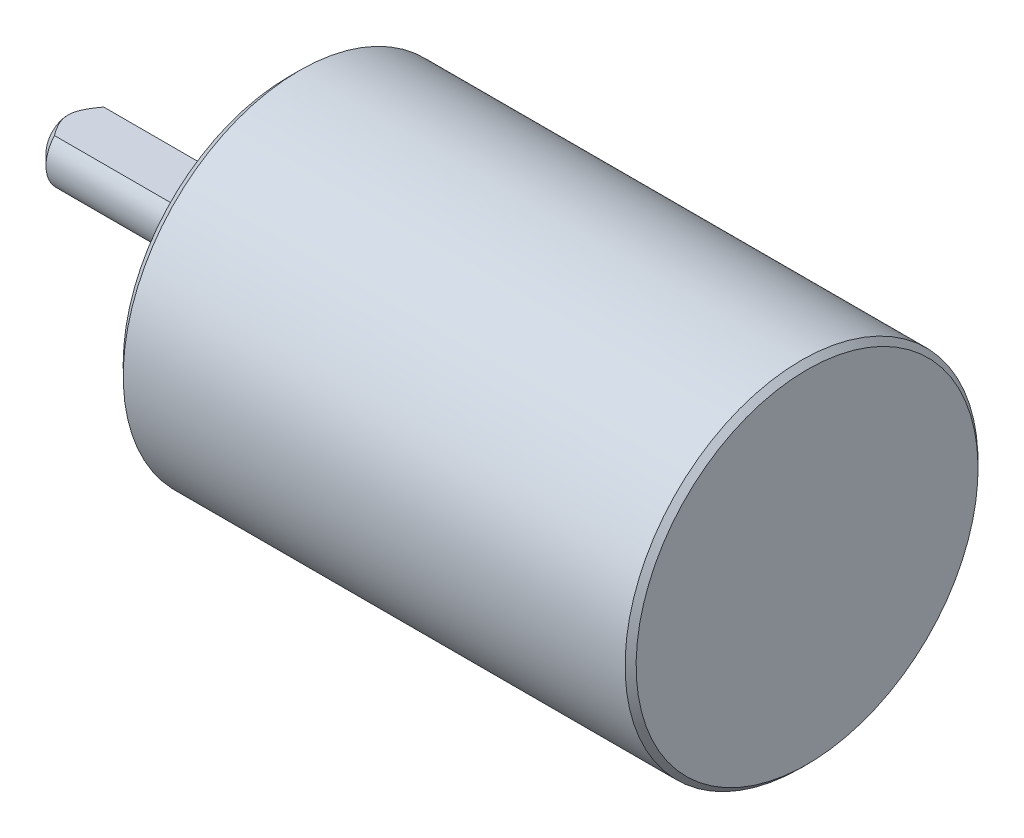
ISO-10303-21;
HEADER;
FILE_DESCRIPTION(('STEP AP214'),'2;1');
FILE_NAME('part.step','',(''),(''),'','','');
FILE_SCHEMA(('AUTOMOTIVE_DESIGN { 1 0 10303 214 1 1 1 1 }'));
ENDSEC;
DATA;
#1=APPLICATION_CONTEXT('core data for automotive mechanical design processes');
#2=APPLICATION_PROTOCOL_DEFINITION('international standard','automotive_design',2000,#1);
#3=PRODUCT_CONTEXT('',#1,'mechanical');
#4=PRODUCT('Part','Part','',(#3));
#5=PRODUCT_RELATED_PRODUCT_CATEGORY('part','',(#4));
#6=PRODUCT_DEFINITION_FORMATION('','',#4);
#7=PRODUCT_DEFINITION_CONTEXT('part definition',#1,'design');
#8=PRODUCT_DEFINITION('design','',#6,#7);
#9=PRODUCT_DEFINITION_SHAPE('','',#8);
#10=(LENGTH_UNIT() NAMED_UNIT(*) SI_UNIT(.MILLI.,.METRE.));
#11=(NAMED_UNIT(*) PLANE_ANGLE_UNIT() SI_UNIT($,.RADIAN.));
#12=(NAMED_UNIT(*) SI_UNIT($,.STERADIAN.) SOLID_ANGLE_UNIT());
#13=UNCERTAINTY_MEASURE_WITH_UNIT(LENGTH_MEASURE(1.E-05),#10,'distance_accuracy_value','');
#14=(GEOMETRIC_REPRESENTATION_CONTEXT(3) GLOBAL_UNCERTAINTY_ASSIGNED_CONTEXT((#13)) GLOBAL_UNIT_ASSIGNED_CONTEXT((#10,
#11,#12)) REPRESENTATION_CONTEXT('',''));
#15=CARTESIAN_POINT('',(0.,0.,0.));
#16=DIRECTION('',(0.,0.,1.));
#17=DIRECTION('',(1.,0.,0.));
#18=AXIS2_PLACEMENT_3D('',#15,#16,#17);
#19=CARTESIAN_POINT('',(0.,0.,0.));
#20=DIRECTION('',(-1.,0.,0.));
#21=DIRECTION('',(0.,-1.,0.));
#22=AXIS2_PLACEMENT_3D('',#19,#20,#21);
#23=PLANE('',#22);
#24=CARTESIAN_POINT('',(0.,0.,0.));
#25=DIRECTION('',(-1.,0.,0.));
#26=DIRECTION('',(0.,-1.,0.));
#27=AXIS2_PLACEMENT_3D('',#24,#25,#26);
#28=CIRCLE('',#27,2.00000000000004);
#29=CARTESIAN_POINT('',(0.,2.,0.));
#30=VERTEX_POINT('',#29);
#31=EDGE_CURVE('E142',#30,#30,#28,.T.);
#32=ORIENTED_EDGE('',*,*,#31,.T.);
#33=EDGE_LOOP('',(#32));
#34=FACE_BOUND('',#33,.T.);
#35=ADVANCED_FACE('F34',(#34),#23,.T.);
#36=CARTESIAN_POINT('',(67.,0.,0.));
#37=DIRECTION('',(1.,0.,0.));
#38=DIRECTION('',(0.,1.,0.));
#39=AXIS2_PLACEMENT_3D('',#36,#37,#38);
#40=CYLINDRICAL_SURFACE('',#39,3.);
#41=DIRECTION('',(1.,0.,0.));
#42=VECTOR('',#41,1.);
#43=CARTESIAN_POINT('',(67.,2.00000000000002,-2.23606797749979));
#44=LINE('',#43,#42);
#45=CARTESIAN_POINT('',(15.,2.,-2.23606797749979));
#46=VERTEX_POINT('',#45);
#47=CARTESIAN_POINT('',(0.999999999999959,2.,-2.23606797749979));
#48=VERTEX_POINT('',#47);
#49=EDGE_CURVE('E83',#46,#48,#44,.F.);
#50=ORIENTED_EDGE('',*,*,#49,.F.);
#51=CARTESIAN_POINT('',(15.,0.,0.));
#52=DIRECTION('',(1.,0.,0.));
#53=DIRECTION('',(0.,1.,0.));
#54=AXIS2_PLACEMENT_3D('',#51,#52,#53);
#55=CIRCLE('',#54,3.);
#56=CARTESIAN_POINT('',(15.,2.,2.23606797749979));
#57=VERTEX_POINT('',#56);
#58=EDGE_CURVE('E11',#57,#46,#55,.F.);
#59=ORIENTED_EDGE('',*,*,#58,.F.);
#60=DIRECTION('',(1.,0.,0.));
#61=VECTOR('',#60,1.);
#62=CARTESIAN_POINT('',(67.,2.00000000000002,2.23606797749979));
#63=LINE('',#62,#61);
#64=CARTESIAN_POINT('',(0.999999999999959,2.,2.23606797749979));
#65=VERTEX_POINT('',#64);
#66=EDGE_CURVE('E73',#65,#57,#63,.T.);
#67=ORIENTED_EDGE('',*,*,#66,.F.);
#68=CARTESIAN_POINT('',(0.999999999999959,0.,0.));
#69=DIRECTION('',(-1.,0.,0.));
#70=DIRECTION('',(0.,-1.,0.));
#71=AXIS2_PLACEMENT_3D('',#68,#69,#70);
#72=CIRCLE('',#71,3.);
#73=EDGE_CURVE('E90',#65,#48,#72,.F.);
#74=ORIENTED_EDGE('',*,*,#73,.T.);
#75=EDGE_LOOP('',(#50,#59,#67,#74));
#76=FACE_BOUND('',#75,.T.);
#77=CARTESIAN_POINT('',(17.,0.,0.));
#78=DIRECTION('',(1.,0.,0.));
#79=DIRECTION('',(0.,1.,0.));
#80=AXIS2_PLACEMENT_3D('',#77,#78,#79);
#81=CIRCLE('',#80,2.99999999999999);
#82=CARTESIAN_POINT('',(17.,3.,0.));
#83=VERTEX_POINT('',#82);
#84=EDGE_CURVE('E120',#83,#83,#81,.T.);
#85=ORIENTED_EDGE('',*,*,#84,.F.);
#86=EDGE_LOOP('',(#85));
#87=FACE_BOUND('',#86,.T.);
#88=ADVANCED_FACE('F88',(#76,#87),#40,.T.);
#89=CARTESIAN_POINT('',(17.,3.,0.));
#90=DIRECTION('',(-1.,0.,0.));
#91=DIRECTION('',(0.,-1.,0.));
#92=AXIS2_PLACEMENT_3D('',#89,#90,#91);
#93=PLANE('',#92);
#94=CARTESIAN_POINT('',(17.,0.,0.));
#95=DIRECTION('',(-1.,0.,0.));
#96=DIRECTION('',(0.,-1.,0.));
#97=AXIS2_PLACEMENT_3D('',#94,#95,#96);
#98=CIRCLE('',#97,8.99999999999999);
#99=CARTESIAN_POINT('',(17.,-8.99999999999998,0.));
#100=VERTEX_POINT('',#99);
#101=EDGE_CURVE('E138',#100,#100,#98,.T.);
#102=ORIENTED_EDGE('',*,*,#101,.T.);
#103=EDGE_LOOP('',(#102));
#104=FACE_BOUND('',#103,.T.);
#105=ORIENTED_EDGE('',*,*,#84,.T.);
#106=EDGE_LOOP('',(#105));
#107=FACE_BOUND('',#106,.T.);
#108=ADVANCED_FACE('F201',(#104,#107),#93,.T.);
#109=CARTESIAN_POINT('',(67.,0.,0.));
#110=DIRECTION('',(1.,0.,0.));
#111=DIRECTION('',(0.,1.,0.));
#112=AXIS2_PLACEMENT_3D('',#109,#110,#111);
#113=CYLINDRICAL_SURFACE('',#112,9.99999999999999);
#114=CARTESIAN_POINT('',(18.,0.,0.));
#115=DIRECTION('',(-1.,0.,0.));
#116=DIRECTION('',(0.,-1.,0.));
#117=AXIS2_PLACEMENT_3D('',#114,#115,#116);
#118=CIRCLE('',#117,9.99999999999999);
#119=CARTESIAN_POINT('',(18.,-9.99999999999998,0.));
#120=VERTEX_POINT('',#119);
#121=EDGE_CURVE('E135',#120,#120,#118,.F.);
#122=ORIENTED_EDGE('',*,*,#121,.T.);
#123=EDGE_LOOP('',(#122));
#124=FACE_BOUND('',#123,.T.);
#125=CARTESIAN_POINT('',(20.,0.,0.));
#126=DIRECTION('',(1.,0.,0.));
#127=DIRECTION('',(0.,1.,0.));
#128=AXIS2_PLACEMENT_3D('',#125,#126,#127);
#129=CIRCLE('',#128,9.99999999999999);
#130=CARTESIAN_POINT('',(20.,9.99999999999999,0.));
#131=VERTEX_POINT('',#130);
#132=EDGE_CURVE('E117',#131,#131,#129,.T.);
#133=ORIENTED_EDGE('',*,*,#132,.F.);
#134=EDGE_LOOP('',(#133));
#135=FACE_BOUND('',#134,.T.);
#136=ADVANCED_FACE('F197',(#124,#135),#113,.T.);
#137=CARTESIAN_POINT('',(20.,9.99999999999999,0.));
#138=DIRECTION('',(-1.,0.,0.));
#139=DIRECTION('',(0.,-1.,0.));
#140=AXIS2_PLACEMENT_3D('',#137,#138,#139);
#141=PLANE('',#140);
#142=CARTESIAN_POINT('',(20.,0.,0.));
#143=DIRECTION('',(-1.,0.,0.));
#144=DIRECTION('',(0.,-1.,0.));
#145=AXIS2_PLACEMENT_3D('',#142,#143,#144);
#146=CIRCLE('',#145,15.);
#147=CARTESIAN_POINT('',(20.,-15.,0.));
#148=VERTEX_POINT('',#147);
#149=EDGE_CURVE('E132',#148,#148,#146,.T.);
#150=ORIENTED_EDGE('',*,*,#149,.T.);
#151=EDGE_LOOP('',(#150));
#152=FACE_BOUND('',#151,.T.);
#153=CARTESIAN_POINT('',(20.,0.,-13.));
#154=DIRECTION('',(-1.,0.,0.));
#155=DIRECTION('',(0.,0.,1.));
#156=AXIS2_PLACEMENT_3D('',#153,#154,#155);
#157=CIRCLE('',#156,1.25);
#158=CARTESIAN_POINT('',(20.,0.,-11.75));
#159=VERTEX_POINT('',#158);
#160=EDGE_CURVE('E91',#159,#159,#157,.T.);
#161=ORIENTED_EDGE('',*,*,#160,.F.);
#162=EDGE_LOOP('',(#161));
#163=FACE_BOUND('',#162,.T.);
#164=CARTESIAN_POINT('',(20.,13.,0.));
#165=DIRECTION('',(-1.,0.,0.));
#166=DIRECTION('',(0.,0.,1.));
#167=AXIS2_PLACEMENT_3D('',#164,#165,#166);
#168=CIRCLE('',#167,1.25);
#169=CARTESIAN_POINT('',(20.,13.,1.25));
#170=VERTEX_POINT('',#169);
#171=EDGE_CURVE('E99',#170,#170,#168,.T.);
#172=ORIENTED_EDGE('',*,*,#171,.F.);
#173=EDGE_LOOP('',(#172));
#174=FACE_BOUND('',#173,.T.);
#175=CARTESIAN_POINT('',(20.,0.,13.));
#176=DIRECTION('',(-1.,0.,0.));
#177=DIRECTION('',(0.,0.,1.));
#178=AXIS2_PLACEMENT_3D('',#175,#176,#177);
#179=CIRCLE('',#178,1.25);
#180=CARTESIAN_POINT('',(20.,0.,14.25));
#181=VERTEX_POINT('',#180);
#182=EDGE_CURVE('E105',#181,#181,#179,.T.);
#183=ORIENTED_EDGE('',*,*,#182,.F.);
#184=EDGE_LOOP('',(#183));
#185=FACE_BOUND('',#184,.T.);
#186=CARTESIAN_POINT('',(20.,-13.,0.));
#187=DIRECTION('',(-1.,0.,0.));
#188=DIRECTION('',(0.,0.,1.));
#189=AXIS2_PLACEMENT_3D('',#186,#187,#188);
#190=CIRCLE('',#189,1.25);
#191=CARTESIAN_POINT('',(20.,-13.,1.25));
#192=VERTEX_POINT('',#191);
#193=EDGE_CURVE('E111',#192,#192,#190,.T.);
#194=ORIENTED_EDGE('',*,*,#193,.F.);
#195=EDGE_LOOP('',(#194));
#196=FACE_BOUND('',#195,.T.);
#197=ORIENTED_EDGE('',*,*,#132,.T.);
#198=EDGE_LOOP('',(#197));
#199=FACE_BOUND('',#198,.T.);
#200=ADVANCED_FACE('F193',(#152,#163,#174,#185,#196,#199),#141,.T.);
#201=CARTESIAN_POINT('',(67.,0.,0.));
#202=DIRECTION('',(1.,0.,0.));
#203=DIRECTION('',(0.,1.,0.));
#204=AXIS2_PLACEMENT_3D('',#201,#202,#203);
#205=CYLINDRICAL_SURFACE('',#204,16.);
#206=CARTESIAN_POINT('',(21.,0.,0.));
#207=DIRECTION('',(-1.,0.,0.));
#208=DIRECTION('',(0.,-1.,0.));
#209=AXIS2_PLACEMENT_3D('',#206,#207,#208);
#210=CIRCLE('',#209,16.);
#211=CARTESIAN_POINT('',(21.,-16.,0.));
#212=VERTEX_POINT('',#211);
#213=EDGE_CURVE('E129',#212,#212,#210,.F.);
#214=ORIENTED_EDGE('',*,*,#213,.T.);
#215=EDGE_LOOP('',(#214));
#216=FACE_BOUND('',#215,.T.);
#217=CARTESIAN_POINT('',(66.5,0.,0.));
#218=DIRECTION('',(1.,0.,0.));
#219=DIRECTION('',(0.,1.,0.));
#220=AXIS2_PLACEMENT_3D('',#217,#218,#219);
#221=CIRCLE('',#220,16.);
#222=CARTESIAN_POINT('',(66.5,16.,0.));
#223=VERTEX_POINT('',#222);
#224=EDGE_CURVE('E126',#223,#223,#221,.F.);
#225=ORIENTED_EDGE('',*,*,#224,.T.);
#226=EDGE_LOOP('',(#225));
#227=FACE_BOUND('',#226,.T.);
#228=ADVANCED_FACE('F189',(#216,#227),#205,.T.);
#229=CARTESIAN_POINT('',(67.,16.,0.));
#230=DIRECTION('',(1.,0.,0.));
#231=DIRECTION('',(0.,1.,0.));
#232=AXIS2_PLACEMENT_3D('',#229,#230,#231);
#233=PLANE('',#232);
#234=CARTESIAN_POINT('',(67.,0.,0.));
#235=DIRECTION('',(1.,0.,0.));
#236=DIRECTION('',(0.,1.,0.));
#237=AXIS2_PLACEMENT_3D('',#234,#235,#236);
#238=CIRCLE('',#237,15.5);
#239=CARTESIAN_POINT('',(67.,15.5,0.));
#240=VERTEX_POINT('',#239);
#241=EDGE_CURVE('E123',#240,#240,#238,.T.);
#242=ORIENTED_EDGE('',*,*,#241,.T.);
#243=EDGE_LOOP('',(#242));
#244=FACE_BOUND('',#243,.T.);
#245=ADVANCED_FACE('F186',(#244),#233,.T.);
#246=CARTESIAN_POINT('',(24.,-13.,0.));
#247=DIRECTION('',(-1.,0.,0.));
#248=DIRECTION('',(0.,0.,1.));
#249=AXIS2_PLACEMENT_3D('',#246,#247,#248);
#250=CONICAL_SURFACE('',#249,1.25,1.02974425867665);
#251=CARTESIAN_POINT('',(24.7510757737845,-13.,0.));
#252=VERTEX_POINT('',#251);
#253=VERTEX_LOOP('',#252);
#254=FACE_BOUND('',#253,.T.);
#255=CARTESIAN_POINT('',(24.,-13.,0.));
#256=DIRECTION('',(-1.,0.,0.));
#257=DIRECTION('',(0.,0.,1.));
#258=AXIS2_PLACEMENT_3D('',#255,#256,#257);
#259=CIRCLE('',#258,1.25);
#260=CARTESIAN_POINT('',(24.,-13.,1.25));
#261=VERTEX_POINT('',#260);
#262=EDGE_CURVE('E114',#261,#261,#259,.T.);
#263=ORIENTED_EDGE('',*,*,#262,.T.);
#264=EDGE_LOOP('',(#263));
#265=FACE_BOUND('',#264,.T.);
#266=ADVANCED_FACE('F182',(#254,#265),#250,.F.);
#267=CARTESIAN_POINT('',(20.,-13.,0.));
#268=DIRECTION('',(-1.,0.,0.));
#269=DIRECTION('',(0.,0.,1.));
#270=AXIS2_PLACEMENT_3D('',#267,#268,#269);
#271=CYLINDRICAL_SURFACE('',#270,1.25);
#272=ORIENTED_EDGE('',*,*,#262,.F.);
#273=EDGE_LOOP('',(#272));
#274=FACE_BOUND('',#273,.T.);
#275=ORIENTED_EDGE('',*,*,#193,.T.);
#276=EDGE_LOOP('',(#275));
#277=FACE_BOUND('',#276,.T.);
#278=ADVANCED_FACE('F178',(#274,#277),#271,.F.);
#279=CARTESIAN_POINT('',(24.,0.,13.));
#280=DIRECTION('',(-1.,0.,0.));
#281=DIRECTION('',(0.,0.,1.));
#282=AXIS2_PLACEMENT_3D('',#279,#280,#281);
#283=CONICAL_SURFACE('',#282,1.25,1.02974425867665);
#284=CARTESIAN_POINT('',(24.7510757737845,0.,13.));
#285=VERTEX_POINT('',#284);
#286=VERTEX_LOOP('',#285);
#287=FACE_BOUND('',#286,.T.);
#288=CARTESIAN_POINT('',(24.,0.,13.));
#289=DIRECTION('',(-1.,0.,0.));
#290=DIRECTION('',(0.,0.,1.));
#291=AXIS2_PLACEMENT_3D('',#288,#289,#290);
#292=CIRCLE('',#291,1.25);
#293=CARTESIAN_POINT('',(24.,0.,14.25));
#294=VERTEX_POINT('',#293);
#295=EDGE_CURVE('E108',#294,#294,#292,.T.);
#296=ORIENTED_EDGE('',*,*,#295,.T.);
#297=EDGE_LOOP('',(#296));
#298=FACE_BOUND('',#297,.T.);
#299=ADVANCED_FACE('F174',(#287,#298),#283,.F.);
#300=CARTESIAN_POINT('',(20.,0.,13.));
#301=DIRECTION('',(-1.,0.,0.));
#302=DIRECTION('',(0.,0.,1.));
#303=AXIS2_PLACEMENT_3D('',#300,#301,#302);
#304=CYLINDRICAL_SURFACE('',#303,1.25);
#305=ORIENTED_EDGE('',*,*,#295,.F.);
#306=EDGE_LOOP('',(#305));
#307=FACE_BOUND('',#306,.T.);
#308=ORIENTED_EDGE('',*,*,#182,.T.);
#309=EDGE_LOOP('',(#308));
#310=FACE_BOUND('',#309,.T.);
#311=ADVANCED_FACE('F170',(#307,#310),#304,.F.);
#312=CARTESIAN_POINT('',(24.,13.,0.));
#313=DIRECTION('',(-1.,0.,0.));
#314=DIRECTION('',(0.,0.,1.));
#315=AXIS2_PLACEMENT_3D('',#312,#313,#314);
#316=CONICAL_SURFACE('',#315,1.25,1.02974425867665);
#317=CARTESIAN_POINT('',(24.7510757737845,13.,0.));
#318=VERTEX_POINT('',#317);
#319=VERTEX_LOOP('',#318);
#320=FACE_BOUND('',#319,.T.);
#321=CARTESIAN_POINT('',(24.,13.,0.));
#322=DIRECTION('',(-1.,0.,0.));
#323=DIRECTION('',(0.,0.,1.));
#324=AXIS2_PLACEMENT_3D('',#321,#322,#323);
#325=CIRCLE('',#324,1.25);
#326=CARTESIAN_POINT('',(24.,13.,1.25));
#327=VERTEX_POINT('',#326);
#328=EDGE_CURVE('E102',#327,#327,#325,.T.);
#329=ORIENTED_EDGE('',*,*,#328,.T.);
#330=EDGE_LOOP('',(#329));
#331=FACE_BOUND('',#330,.T.);
#332=ADVANCED_FACE('F166',(#320,#331),#316,.F.);
#333=CARTESIAN_POINT('',(20.,13.,0.));
#334=DIRECTION('',(-1.,0.,0.));
#335=DIRECTION('',(0.,0.,1.));
#336=AXIS2_PLACEMENT_3D('',#333,#334,#335);
#337=CYLINDRICAL_SURFACE('',#336,1.25);
#338=ORIENTED_EDGE('',*,*,#328,.F.);
#339=EDGE_LOOP('',(#338));
#340=FACE_BOUND('',#339,.T.);
#341=ORIENTED_EDGE('',*,*,#171,.T.);
#342=EDGE_LOOP('',(#341));
#343=FACE_BOUND('',#342,.T.);
#344=ADVANCED_FACE('F162',(#340,#343),#337,.F.);
#345=CARTESIAN_POINT('',(24.,0.,-13.));
#346=DIRECTION('',(-1.,0.,0.));
#347=DIRECTION('',(0.,0.,1.));
#348=AXIS2_PLACEMENT_3D('',#345,#346,#347);
#349=CONICAL_SURFACE('',#348,1.25,1.02974425867665);
#350=CARTESIAN_POINT('',(24.7510757737845,0.,-13.));
#351=VERTEX_POINT('',#350);
#352=VERTEX_LOOP('',#351);
#353=FACE_BOUND('',#352,.T.);
#354=CARTESIAN_POINT('',(24.,0.,-13.));
#355=DIRECTION('',(-1.,0.,0.));
#356=DIRECTION('',(0.,0.,1.));
#357=AXIS2_PLACEMENT_3D('',#354,#355,#356);
#358=CIRCLE('',#357,1.25);
#359=CARTESIAN_POINT('',(24.,0.,-11.75));
#360=VERTEX_POINT('',#359);
#361=EDGE_CURVE('E94',#360,#360,#358,.T.);
#362=ORIENTED_EDGE('',*,*,#361,.T.);
#363=EDGE_LOOP('',(#362));
#364=FACE_BOUND('',#363,.T.);
#365=ADVANCED_FACE('F158',(#353,#364),#349,.F.);
#366=CARTESIAN_POINT('',(20.,0.,-13.));
#367=DIRECTION('',(-1.,0.,0.));
#368=DIRECTION('',(0.,0.,1.));
#369=AXIS2_PLACEMENT_3D('',#366,#367,#368);
#370=CYLINDRICAL_SURFACE('',#369,1.25);
#371=ORIENTED_EDGE('',*,*,#361,.F.);
#372=EDGE_LOOP('',(#371));
#373=FACE_BOUND('',#372,.T.);
#374=ORIENTED_EDGE('',*,*,#160,.T.);
#375=EDGE_LOOP('',(#374));
#376=FACE_BOUND('',#375,.T.);
#377=ADVANCED_FACE('F154',(#373,#376),#370,.F.);
#378=CARTESIAN_POINT('',(67.,0.,0.));
#379=DIRECTION('',(-1.,0.,0.));
#380=DIRECTION('',(0.,-1.,0.));
#381=AXIS2_PLACEMENT_3D('',#378,#379,#380);
#382=CONICAL_SURFACE('',#381,15.5,0.785398163397452);
#383=ORIENTED_EDGE('',*,*,#224,.F.);
#384=EDGE_LOOP('',(#383));
#385=FACE_BOUND('',#384,.T.);
#386=ORIENTED_EDGE('',*,*,#241,.F.);
#387=EDGE_LOOP('',(#386));
#388=FACE_BOUND('',#387,.T.);
#389=ADVANCED_FACE('F157',(#385,#388),#382,.T.);
#390=CARTESIAN_POINT('',(21.,0.,0.));
#391=DIRECTION('',(1.,0.,0.));
#392=DIRECTION('',(0.,1.,0.));
#393=AXIS2_PLACEMENT_3D('',#390,#391,#392);
#394=CONICAL_SURFACE('',#393,16.,0.785398163397453);
#395=ORIENTED_EDGE('',*,*,#149,.F.);
#396=EDGE_LOOP('',(#395));
#397=FACE_BOUND('',#396,.T.);
#398=ORIENTED_EDGE('',*,*,#213,.F.);
#399=EDGE_LOOP('',(#398));
#400=FACE_BOUND('',#399,.T.);
#401=ADVANCED_FACE('F213',(#397,#400),#394,.T.);
#402=CARTESIAN_POINT('',(18.,0.,0.));
#403=DIRECTION('',(-1.,0.,0.));
#404=DIRECTION('',(0.,-1.,0.));
#405=AXIS2_PLACEMENT_3D('',#402,#403,#404);
#406=TOROIDAL_SURFACE('',#405,8.99999999999999,1.);
#407=ORIENTED_EDGE('',*,*,#101,.F.);
#408=EDGE_LOOP('',(#407));
#409=FACE_BOUND('',#408,.T.);
#410=ORIENTED_EDGE('',*,*,#121,.F.);
#411=EDGE_LOOP('',(#410));
#412=FACE_BOUND('',#411,.T.);
#413=ADVANCED_FACE('F216',(#409,#412),#406,.T.);
#414=CARTESIAN_POINT('',(0.999999999999959,0.,0.));
#415=DIRECTION('',(1.,0.,0.));
#416=DIRECTION('',(0.,1.,0.));
#417=AXIS2_PLACEMENT_3D('',#414,#415,#416);
#418=CONICAL_SURFACE('',#417,3.,0.785398163397449);
#419=CARTESIAN_POINT('',(2.64735037147121,2.,-4.19498098627562));
#420=CARTESIAN_POINT('',(2.56227376036563,2.,-4.1007176336002));
#421=CARTESIAN_POINT('',(2.4774769407958,2.,-4.00619969417623));
#422=CARTESIAN_POINT('',(2.30859005453811,2.,-3.81652190724905));
#423=CARTESIAN_POINT('',(2.22450004219928,2.,-3.72136201137943));
#424=CARTESIAN_POINT('',(2.05692715537562,2.,-3.52998520258133));
#425=CARTESIAN_POINT('',(1.97344697736533,2.,-3.43376592480723));
#426=CARTESIAN_POINT('',(1.80758102210381,2.,-3.24039295320355));
#427=CARTESIAN_POINT('',(1.72519520762171,2.,-3.1432392913571));
#428=CARTESIAN_POINT('',(1.55714691513772,2.,-2.94219550302539));
#429=CARTESIAN_POINT('',(1.47156568082886,2.,-2.8382372930877));
#430=CARTESIAN_POINT('',(1.30244067009423,2.,-2.62867792880836));
#431=CARTESIAN_POINT('',(1.21889680306694,2.,-2.52307684786834));
#432=CARTESIAN_POINT('',(1.05465967269191,2.,-2.30988403023064));
#433=CARTESIAN_POINT('',(0.973962945183142,2.,-2.20229497371581));
#434=CARTESIAN_POINT('',(0.816387362030972,2.,-1.98436917349164));
#435=CARTESIAN_POINT('',(0.739507571087058,2.,-1.87403311295621));
#436=CARTESIAN_POINT('',(0.607609294843402,2.,-1.67448925723662));
#437=CARTESIAN_POINT('',(0.551513028604606,2.,-1.58599803170236));
#438=CARTESIAN_POINT('',(0.443826291375629,2.,-1.40622771824962));
#439=CARTESIAN_POINT('',(0.392237885358382,2.,-1.31494737825899));
#440=CARTESIAN_POINT('',(0.295768448993919,2.,-1.12992559059664));
#441=CARTESIAN_POINT('',(0.250830526597938,2.,-1.03621418872764));
#442=CARTESIAN_POINT('',(0.169520725091139,2.,-0.845143098913066));
#443=CARTESIAN_POINT('',(0.133140141268117,2.,-0.74778723610586));
#444=CARTESIAN_POINT('',(0.0843022244844682,2.,-0.589474873118612));
#445=CARTESIAN_POINT('',(0.0681135468340602,2.,-0.529670169927612));
#446=CARTESIAN_POINT('',(0.0405378123602302,2.,-0.408954351751457));
#447=CARTESIAN_POINT('',(0.0291500046307554,2.,-0.348043411349052));
#448=CARTESIAN_POINT('',(0.0117844482097207,2.,-0.225673698629841));
#449=CARTESIAN_POINT('',(0.00578686238295228,2.,-0.164217782628723));
#450=CARTESIAN_POINT('',(-0.000525477724369348,2.,-0.0410107717533667));
#451=CARTESIAN_POINT('',(-0.000840353160307369,2.,0.0207403167997155));
#452=CARTESIAN_POINT('',(0.00423166998278092,2.,0.144008084680025));
#453=CARTESIAN_POINT('',(0.0096189610927208,2.,0.205524747577065));
#454=CARTESIAN_POINT('',(0.025785185187563,2.,0.327848129004505));
#455=CARTESIAN_POINT('',(0.0365653926983147,2.,0.388654676232908));
#456=CARTESIAN_POINT('',(0.063020229064213,2.,0.509455769763526));
#457=CARTESIAN_POINT('',(0.0787158463552608,2.,0.569445660684733));
#458=CARTESIAN_POINT('',(0.114317717751172,2.,0.688143489456393));
#459=CARTESIAN_POINT('',(0.134224092900815,2.,0.746851390400516));
#460=CARTESIAN_POINT('',(0.208649790857987,2.,0.946252272751983));
#461=CARTESIAN_POINT('',(0.271851902613598,2.,1.08371994743288));
#462=CARTESIAN_POINT('',(0.376390299297901,2.,1.28471204665488));
#463=CARTESIAN_POINT('',(0.412911723907717,2.,1.350922182795));
#464=CARTESIAN_POINT('',(0.488569168950156,2.,1.48183529733466));
#465=CARTESIAN_POINT('',(0.52770470236517,2.,1.54653855345863));
#466=CARTESIAN_POINT('',(0.60861104531015,2.,1.67553219235764));
#467=CARTESIAN_POINT('',(0.650411162863642,2.,1.73980399027458));
#468=CARTESIAN_POINT('',(0.735726154720057,2.,1.86719964216076));
#469=CARTESIAN_POINT('',(0.779241077125681,2.,1.93032346385495));
#470=CARTESIAN_POINT('',(0.867609282679084,2.,2.05551634566995));
#471=CARTESIAN_POINT('',(0.912460987831962,2.,2.11758652346535));
#472=CARTESIAN_POINT('',(1.00330227283849,2.,2.24088281326278));
#473=CARTESIAN_POINT('',(1.04929180999788,2.,2.30210895680121));
#474=CARTESIAN_POINT('',(1.20569099583598,2.,2.50702372457019));
#475=CARTESIAN_POINT('',(1.31825374350581,2.,2.64906880771568));
#476=CARTESIAN_POINT('',(1.54685964525937,2.,2.93033813561335));
#477=CARTESIAN_POINT('',(1.66290332957477,2.,3.06956194514917));
#478=CARTESIAN_POINT('',(1.89747871168869,2.,3.34599544349093));
#479=CARTESIAN_POINT('',(2.0160114548813,2.,3.48320424315831));
#480=CARTESIAN_POINT('',(2.25484923361209,2.,3.75607310538424));
#481=CARTESIAN_POINT('',(2.37515432280639,2.,3.89173312083321));
#482=CARTESIAN_POINT('',(2.61733995428957,2.,4.16214503396349));
#483=CARTESIAN_POINT('',(2.73922324594966,2.,4.29689446552967));
#484=CARTESIAN_POINT('',(2.98401382712602,2.,4.5654607055951));
#485=CARTESIAN_POINT('',(3.10692112521368,2.,4.69927750627056));
#486=CARTESIAN_POINT('',(3.47676584494473,2.,5.09955460178555));
#487=CARTESIAN_POINT('',(3.7248926891865,2.,5.36491540939226));
#488=CARTESIAN_POINT('',(4.19365689186766,2.,5.86237079128897));
#489=CARTESIAN_POINT('',(4.41406677528535,2.,6.09468047040231));
#490=CARTESIAN_POINT('',(4.85605079803961,2.,6.55822514113025));
#491=CARTESIAN_POINT('',(5.07762502987164,2.,6.78946004452887));
#492=CARTESIAN_POINT('',(5.52081131078293,2.,7.25028153370056));
#493=CARTESIAN_POINT('',(5.74242030974738,2.,7.47987105602969));
#494=CARTESIAN_POINT('',(6.18626745596256,2.,7.93840037629884));
#495=CARTESIAN_POINT('',(6.40850554340591,2.,8.16734023211563));
#496=CARTESIAN_POINT('',(6.63097485937854,2.,8.39605425323259));
#497=B_SPLINE_CURVE_WITH_KNOTS('',3,(#419,#420,#421,#422,#423,#424,#425,#426,#427,#428,#429,
#430,#431,#432,#433,#434,#435,#436,#437,#438,#439,#440,#441,#442,#443,#444,#445,#446,#447,#448,
#449,#450,#451,#452,#453,#454,#455,#456,#457,#458,#459,#460,#461,#462,#463,#464,#465,#466,#467,
#468,#469,#470,#471,#472,#473,#474,#475,#476,#477,#478,#479,#480,#481,#482,#483,#484,#485,#486,
#487,#488,#489,#490,#491,#492,#493,#494,#495,#496),.UNSPECIFIED.,.F.,.F.,(4,2,2,2,2,2,2,2,2,2,2,
2,2,2,2,2,2,2,2,2,2,2,2,2,2,2,2,2,2,2,2,2,2,2,2,2,2,2,4),(0.,0.380938047343513,
0.761905123274237,1.14405530355829,1.52619244940752,1.93013276771128,2.33405508995292,
2.73746769974144,3.14078096459005,3.45500589714848,3.7693740242806,4.08087448073537,
4.39205668837901,4.57776391897893,4.76344209224774,4.94843409942261,5.13342216256326,
5.31842296090827,5.5034675017763,5.68931319718697,5.87516423574725,6.32767094650071,
6.55450293143056,6.78129277400469,7.01127017283952,7.24125402746417,7.47097638660671,
7.7006901390333,8.24430659960588,8.7880062909948,9.33193909140001,9.87588839283537,
10.4209655272662,10.9660472288257,12.0559123925025,13.0166034848417,13.9773720840311,
14.9346570770966,15.8918539284436),.UNSPECIFIED.);
#498=EDGE_CURVE('E43',#48,#30,#497,.T.);
#499=ORIENTED_EDGE('',*,*,#498,.F.);
#500=ORIENTED_EDGE('',*,*,#73,.F.);
#501=EDGE_CURVE('E78',#30,#65,#497,.T.);
#502=ORIENTED_EDGE('',*,*,#501,.F.);
#503=ORIENTED_EDGE('',*,*,#31,.F.);
#504=EDGE_LOOP('',(#499,#500,#502,#503));
#505=FACE_BOUND('',#504,.T.);
#506=ADVANCED_FACE('F36',(#505),#418,.T.);
#507=CARTESIAN_POINT('',(15.,2.,-3.));
#508=DIRECTION('',(1.,0.,0.));
#509=DIRECTION('',(0.,1.,0.));
#510=AXIS2_PLACEMENT_3D('',#507,#508,#509);
#511=PLANE('',#510);
#512=ORIENTED_EDGE('',*,*,#58,.T.);
#513=DIRECTION('',(0.,0.,-1.));
#514=VECTOR('',#513,1.);
#515=CARTESIAN_POINT('',(15.,2.,-3.));
#516=LINE('',#515,#514);
#517=EDGE_CURVE('E76',#57,#46,#516,.T.);
#518=ORIENTED_EDGE('',*,*,#517,.F.);
#519=EDGE_LOOP('',(#512,#518));
#520=FACE_BOUND('',#519,.T.);
#521=ADVANCED_FACE('F86',(#520),#511,.F.);
#522=CARTESIAN_POINT('',(0.,2.,0.));
#523=DIRECTION('',(0.,-1.,0.));
#524=DIRECTION('',(1.,0.,0.));
#525=AXIS2_PLACEMENT_3D('',#522,#523,#524);
#526=PLANE('',#525);
#527=ORIENTED_EDGE('',*,*,#49,.T.);
#528=ORIENTED_EDGE('',*,*,#498,.T.);
#529=ORIENTED_EDGE('',*,*,#501,.T.);
#530=ORIENTED_EDGE('',*,*,#66,.T.);
#531=ORIENTED_EDGE('',*,*,#517,.T.);
#532=EDGE_LOOP('',(#527,#528,#529,#530,#531));
#533=FACE_BOUND('',#532,.T.);
#534=ADVANCED_FACE('F75',(#533),#526,.F.);
#535=CLOSED_SHELL('',(#35,#88,#108,#136,#200,#228,#245,#266,#278,#299,#311,#332,#344,#365,#377,
#389,#401,#413,#506,#521,#534));
#536=MANIFOLD_SOLID_BREP('B2',#535);
#537=ADVANCED_BREP_SHAPE_REPRESENTATION('',(#18,#536),#14);
#538=SHAPE_DEFINITION_REPRESENTATION(#9,#537);
ENDSEC;
END-ISO-10303-21;
